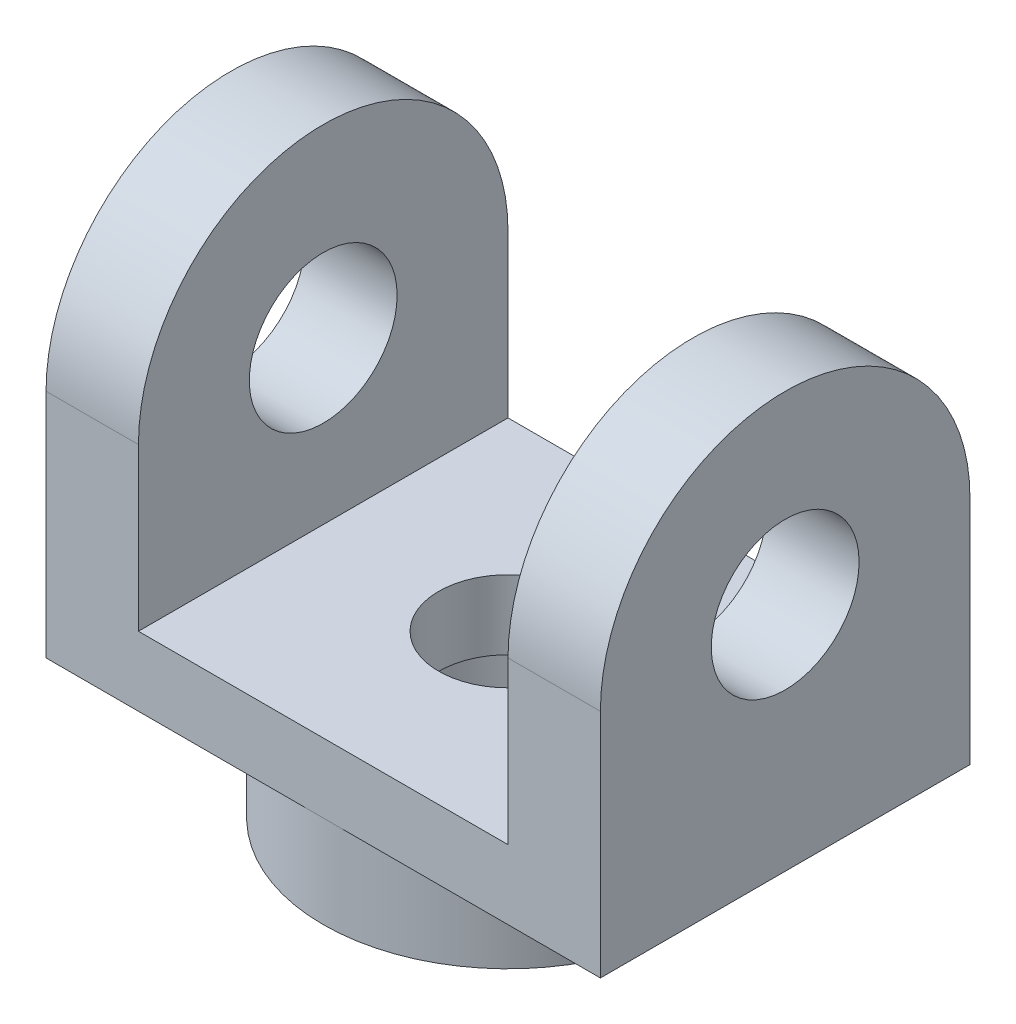
ISO-10303-21;
HEADER;
FILE_DESCRIPTION(('STEP AP214'),'2;1');
FILE_NAME('part.step','',(''),(''),'','','');
FILE_SCHEMA(('AUTOMOTIVE_DESIGN { 1 0 10303 214 1 1 1 1 }'));
ENDSEC;
DATA;
#1=APPLICATION_CONTEXT('core data for automotive mechanical design processes');
#2=APPLICATION_PROTOCOL_DEFINITION('international standard','automotive_design',2000,#1);
#3=PRODUCT_CONTEXT('',#1,'mechanical');
#4=PRODUCT('Part','Part','',(#3));
#5=PRODUCT_RELATED_PRODUCT_CATEGORY('part','',(#4));
#6=PRODUCT_DEFINITION_FORMATION('','',#4);
#7=PRODUCT_DEFINITION_CONTEXT('part definition',#1,'design');
#8=PRODUCT_DEFINITION('design','',#6,#7);
#9=PRODUCT_DEFINITION_SHAPE('','',#8);
#10=(LENGTH_UNIT() NAMED_UNIT(*) SI_UNIT(.MILLI.,.METRE.));
#11=(NAMED_UNIT(*) PLANE_ANGLE_UNIT() SI_UNIT($,.RADIAN.));
#12=(NAMED_UNIT(*) SI_UNIT($,.STERADIAN.) SOLID_ANGLE_UNIT());
#13=UNCERTAINTY_MEASURE_WITH_UNIT(LENGTH_MEASURE(1.E-05),#10,'distance_accuracy_value','');
#14=(GEOMETRIC_REPRESENTATION_CONTEXT(3) GLOBAL_UNCERTAINTY_ASSIGNED_CONTEXT((#13)) GLOBAL_UNIT_ASSIGNED_CONTEXT((#10,
#11,#12)) REPRESENTATION_CONTEXT('',''));
#15=CARTESIAN_POINT('',(0.,0.,0.));
#16=DIRECTION('',(0.,0.,1.));
#17=DIRECTION('',(1.,0.,0.));
#18=AXIS2_PLACEMENT_3D('',#15,#16,#17);
#19=CARTESIAN_POINT('',(0.,35.,0.));
#20=DIRECTION('',(0.,-1.,0.));
#21=DIRECTION('',(0.,0.,-1.));
#22=AXIS2_PLACEMENT_3D('',#19,#20,#21);
#23=PLANE('',#22);
#24=CARTESIAN_POINT('',(0.,35.,0.));
#25=DIRECTION('',(0.,-1.,0.));
#26=DIRECTION('',(0.,0.,-1.));
#27=AXIS2_PLACEMENT_3D('',#24,#25,#26);
#28=CIRCLE('',#27,15.);
#29=CARTESIAN_POINT('',(0.,35.,-15.));
#30=VERTEX_POINT('',#29);
#31=EDGE_CURVE('E42',#30,#30,#28,.T.);
#32=ORIENTED_EDGE('',*,*,#31,.T.);
#33=EDGE_LOOP('',(#32));
#34=FACE_BOUND('',#33,.T.);
#35=DIRECTION('',(0.,0.,1.));
#36=VECTOR('',#35,1.);
#37=CARTESIAN_POINT('',(-40.,35.,-40.));
#38=LINE('',#37,#36);
#39=CARTESIAN_POINT('',(-40.,35.,-40.));
#40=VERTEX_POINT('',#39);
#41=CARTESIAN_POINT('',(-40.,35.,40.));
#42=VERTEX_POINT('',#41);
#43=EDGE_CURVE('E55',#40,#42,#38,.T.);
#44=ORIENTED_EDGE('',*,*,#43,.T.);
#45=DIRECTION('',(1.,0.,0.));
#46=VECTOR('',#45,1.);
#47=CARTESIAN_POINT('',(-60.,35.,40.));
#48=LINE('',#47,#46);
#49=CARTESIAN_POINT('',(40.,35.,40.));
#50=VERTEX_POINT('',#49);
#51=EDGE_CURVE('E174',#42,#50,#48,.T.);
#52=ORIENTED_EDGE('',*,*,#51,.T.);
#53=DIRECTION('',(0.,0.,1.));
#54=VECTOR('',#53,1.);
#55=CARTESIAN_POINT('',(40.,35.,-40.));
#56=LINE('',#55,#54);
#57=CARTESIAN_POINT('',(40.,35.,-40.));
#58=VERTEX_POINT('',#57);
#59=EDGE_CURVE('E164',#58,#50,#56,.T.);
#60=ORIENTED_EDGE('',*,*,#59,.F.);
#61=DIRECTION('',(-1.,0.,0.));
#62=VECTOR('',#61,1.);
#63=CARTESIAN_POINT('',(-60.,35.,-40.));
#64=LINE('',#63,#62);
#65=EDGE_CURVE('E60',#58,#40,#64,.T.);
#66=ORIENTED_EDGE('',*,*,#65,.T.);
#67=EDGE_LOOP('',(#44,#52,#60,#66));
#68=FACE_BOUND('',#67,.T.);
#69=ADVANCED_FACE('F38',(#34,#68),#23,.F.);
#70=CARTESIAN_POINT('',(0.,20.,0.));
#71=DIRECTION('',(0.,-1.,0.));
#72=DIRECTION('',(0.,0.,-1.));
#73=AXIS2_PLACEMENT_3D('',#70,#71,#72);
#74=CYLINDRICAL_SURFACE('',#73,30.);
#75=CARTESIAN_POINT('',(0.,20.,0.));
#76=DIRECTION('',(0.,1.,0.));
#77=DIRECTION('',(0.,0.,1.));
#78=AXIS2_PLACEMENT_3D('',#75,#76,#77);
#79=CIRCLE('',#78,30.);
#80=CARTESIAN_POINT('',(0.,20.,30.));
#81=VERTEX_POINT('',#80);
#82=EDGE_CURVE('E193',#81,#81,#79,.T.);
#83=ORIENTED_EDGE('',*,*,#82,.T.);
#84=EDGE_LOOP('',(#83));
#85=FACE_BOUND('',#84,.T.);
#86=CARTESIAN_POINT('',(0.,0.,0.));
#87=DIRECTION('',(0.,1.,0.));
#88=DIRECTION('',(0.,0.,1.));
#89=AXIS2_PLACEMENT_3D('',#86,#87,#88);
#90=CIRCLE('',#89,30.);
#91=CARTESIAN_POINT('',(0.,0.,30.));
#92=VERTEX_POINT('',#91);
#93=EDGE_CURVE('E195',#92,#92,#90,.T.);
#94=ORIENTED_EDGE('',*,*,#93,.F.);
#95=EDGE_LOOP('',(#94));
#96=FACE_BOUND('',#95,.T.);
#97=ADVANCED_FACE('F40',(#85,#96),#74,.F.);
#98=CARTESIAN_POINT('',(0.,20.,0.));
#99=DIRECTION('',(0.,-1.,0.));
#100=DIRECTION('',(0.,0.,-1.));
#101=AXIS2_PLACEMENT_3D('',#98,#99,#100);
#102=CYLINDRICAL_SURFACE('',#101,40.);
#103=CARTESIAN_POINT('',(0.,20.,0.));
#104=DIRECTION('',(0.,1.,0.));
#105=DIRECTION('',(0.,0.,1.));
#106=AXIS2_PLACEMENT_3D('',#103,#104,#105);
#107=CIRCLE('',#106,40.);
#108=CARTESIAN_POINT('',(0.,20.,40.));
#109=VERTEX_POINT('',#108);
#110=CARTESIAN_POINT('',(0.,20.,-40.));
#111=VERTEX_POINT('',#110);
#112=EDGE_CURVE('E11',#109,#111,#107,.T.);
#113=ORIENTED_EDGE('',*,*,#112,.F.);
#114=EDGE_CURVE('E47',#111,#109,#107,.T.);
#115=ORIENTED_EDGE('',*,*,#114,.F.);
#116=EDGE_LOOP('',(#113,#115));
#117=FACE_BOUND('',#116,.T.);
#118=CARTESIAN_POINT('',(0.,0.,0.));
#119=DIRECTION('',(0.,1.,0.));
#120=DIRECTION('',(0.,0.,1.));
#121=AXIS2_PLACEMENT_3D('',#118,#119,#120);
#122=CIRCLE('',#121,40.);
#123=CARTESIAN_POINT('',(0.,0.,40.));
#124=VERTEX_POINT('',#123);
#125=EDGE_CURVE('E198',#124,#124,#122,.T.);
#126=ORIENTED_EDGE('',*,*,#125,.T.);
#127=EDGE_LOOP('',(#126));
#128=FACE_BOUND('',#127,.T.);
#129=ADVANCED_FACE('F251',(#117,#128),#102,.T.);
#130=CARTESIAN_POINT('',(0.,0.,0.));
#131=DIRECTION('',(0.,1.,0.));
#132=DIRECTION('',(0.,0.,1.));
#133=AXIS2_PLACEMENT_3D('',#130,#131,#132);
#134=PLANE('',#133);
#135=ORIENTED_EDGE('',*,*,#93,.T.);
#136=EDGE_LOOP('',(#135));
#137=FACE_BOUND('',#136,.T.);
#138=ORIENTED_EDGE('',*,*,#125,.F.);
#139=EDGE_LOOP('',(#138));
#140=FACE_BOUND('',#139,.T.);
#141=ADVANCED_FACE('F260',(#137,#140),#134,.F.);
#142=CARTESIAN_POINT('',(0.,20.,0.));
#143=DIRECTION('',(0.,-1.,0.));
#144=DIRECTION('',(0.,0.,-1.));
#145=AXIS2_PLACEMENT_3D('',#142,#143,#144);
#146=PLANE('',#145);
#147=DIRECTION('',(-1.,0.,0.));
#148=VECTOR('',#147,1.);
#149=CARTESIAN_POINT('',(-60.,20.,-40.));
#150=LINE('',#149,#148);
#151=CARTESIAN_POINT('',(-60.,20.,-40.));
#152=VERTEX_POINT('',#151);
#153=EDGE_CURVE('E180',#111,#152,#150,.T.);
#154=ORIENTED_EDGE('',*,*,#153,.F.);
#155=ORIENTED_EDGE('',*,*,#114,.T.);
#156=DIRECTION('',(1.,0.,0.));
#157=VECTOR('',#156,1.);
#158=CARTESIAN_POINT('',(-60.,20.,40.));
#159=LINE('',#158,#157);
#160=CARTESIAN_POINT('',(-60.,20.,40.));
#161=VERTEX_POINT('',#160);
#162=EDGE_CURVE('E175',#161,#109,#159,.T.);
#163=ORIENTED_EDGE('',*,*,#162,.F.);
#164=DIRECTION('',(0.,0.,1.));
#165=VECTOR('',#164,1.);
#166=CARTESIAN_POINT('',(-60.,20.,40.));
#167=LINE('',#166,#165);
#168=EDGE_CURVE('E128',#152,#161,#167,.T.);
#169=ORIENTED_EDGE('',*,*,#168,.F.);
#170=EDGE_LOOP('',(#154,#155,#163,#169));
#171=FACE_BOUND('',#170,.T.);
#172=ADVANCED_FACE('F206',(#171),#146,.T.);
#173=CARTESIAN_POINT('',(-60.,35.,40.));
#174=DIRECTION('',(0.,0.,-1.));
#175=DIRECTION('',(-1.,0.,0.));
#176=AXIS2_PLACEMENT_3D('',#173,#174,#175);
#177=PLANE('',#176);
#178=ORIENTED_EDGE('',*,*,#162,.T.);
#179=CARTESIAN_POINT('',(60.,20.,40.));
#180=VERTEX_POINT('',#179);
#181=EDGE_CURVE('E185',#109,#180,#159,.T.);
#182=ORIENTED_EDGE('',*,*,#181,.T.);
#183=DIRECTION('',(0.,-1.,0.));
#184=VECTOR('',#183,1.);
#185=CARTESIAN_POINT('',(60.,35.,40.));
#186=LINE('',#185,#184);
#187=CARTESIAN_POINT('',(60.,70.,40.));
#188=VERTEX_POINT('',#187);
#189=EDGE_CURVE('E133',#188,#180,#186,.T.);
#190=ORIENTED_EDGE('',*,*,#189,.F.);
#191=DIRECTION('',(-1.,0.,0.));
#192=VECTOR('',#191,1.);
#193=CARTESIAN_POINT('',(60.,70.,40.));
#194=LINE('',#193,#192);
#195=CARTESIAN_POINT('',(40.,70.,40.));
#196=VERTEX_POINT('',#195);
#197=EDGE_CURVE('E154',#188,#196,#194,.T.);
#198=ORIENTED_EDGE('',*,*,#197,.T.);
#199=DIRECTION('',(0.,-1.,0.));
#200=VECTOR('',#199,1.);
#201=CARTESIAN_POINT('',(40.,35.,40.));
#202=LINE('',#201,#200);
#203=EDGE_CURVE('E161',#196,#50,#202,.T.);
#204=ORIENTED_EDGE('',*,*,#203,.T.);
#205=ORIENTED_EDGE('',*,*,#51,.F.);
#206=DIRECTION('',(0.,-1.,0.));
#207=VECTOR('',#206,1.);
#208=CARTESIAN_POINT('',(-40.,35.,40.));
#209=LINE('',#208,#207);
#210=CARTESIAN_POINT('',(-40.,70.,40.));
#211=VERTEX_POINT('',#210);
#212=EDGE_CURVE('E121',#211,#42,#209,.T.);
#213=ORIENTED_EDGE('',*,*,#212,.F.);
#214=DIRECTION('',(1.,0.,0.));
#215=VECTOR('',#214,1.);
#216=CARTESIAN_POINT('',(-60.,70.,40.));
#217=LINE('',#216,#215);
#218=CARTESIAN_POINT('',(-60.,70.,40.));
#219=VERTEX_POINT('',#218);
#220=EDGE_CURVE('E114',#219,#211,#217,.T.);
#221=ORIENTED_EDGE('',*,*,#220,.F.);
#222=DIRECTION('',(0.,-1.,0.));
#223=VECTOR('',#222,1.);
#224=CARTESIAN_POINT('',(-60.,35.,40.));
#225=LINE('',#224,#223);
#226=EDGE_CURVE('E125',#219,#161,#225,.T.);
#227=ORIENTED_EDGE('',*,*,#226,.T.);
#228=EDGE_LOOP('',(#178,#182,#190,#198,#204,#205,#213,#221,#227));
#229=FACE_BOUND('',#228,.T.);
#230=ADVANCED_FACE('F135',(#229),#177,.F.);
#231=CARTESIAN_POINT('',(-60.,35.,40.));
#232=DIRECTION('',(1.,0.,0.));
#233=DIRECTION('',(0.,0.,-1.));
#234=AXIS2_PLACEMENT_3D('',#231,#232,#233);
#235=PLANE('',#234);
#236=CARTESIAN_POINT('',(-60.,70.,0.));
#237=DIRECTION('',(1.,0.,0.));
#238=DIRECTION('',(0.,0.,-1.));
#239=AXIS2_PLACEMENT_3D('',#236,#237,#238);
#240=CIRCLE('',#239,16.);
#241=CARTESIAN_POINT('',(-60.,70.,-16.));
#242=VERTEX_POINT('',#241);
#243=EDGE_CURVE('E230',#242,#242,#240,.T.);
#244=ORIENTED_EDGE('',*,*,#243,.T.);
#245=EDGE_LOOP('',(#244));
#246=FACE_BOUND('',#245,.T.);
#247=ORIENTED_EDGE('',*,*,#168,.T.);
#248=ORIENTED_EDGE('',*,*,#226,.F.);
#249=CARTESIAN_POINT('',(-60.,70.,0.));
#250=DIRECTION('',(-1.,0.,0.));
#251=DIRECTION('',(0.,0.,1.));
#252=AXIS2_PLACEMENT_3D('',#249,#250,#251);
#253=CIRCLE('',#252,40.);
#254=CARTESIAN_POINT('',(-60.,70.,-40.));
#255=VERTEX_POINT('',#254);
#256=EDGE_CURVE('E110',#219,#255,#253,.T.);
#257=ORIENTED_EDGE('',*,*,#256,.T.);
#258=DIRECTION('',(0.,-1.,0.));
#259=VECTOR('',#258,1.);
#260=CARTESIAN_POINT('',(-60.,35.,-40.));
#261=LINE('',#260,#259);
#262=EDGE_CURVE('E132',#255,#152,#261,.T.);
#263=ORIENTED_EDGE('',*,*,#262,.T.);
#264=EDGE_LOOP('',(#247,#248,#257,#263));
#265=FACE_BOUND('',#264,.T.);
#266=ADVANCED_FACE('F126',(#246,#265),#235,.F.);
#267=CARTESIAN_POINT('',(-60.,35.,-40.));
#268=DIRECTION('',(0.,0.,1.));
#269=DIRECTION('',(1.,0.,0.));
#270=AXIS2_PLACEMENT_3D('',#267,#268,#269);
#271=PLANE('',#270);
#272=CARTESIAN_POINT('',(60.,20.,-40.));
#273=VERTEX_POINT('',#272);
#274=EDGE_CURVE('E181',#273,#111,#150,.T.);
#275=ORIENTED_EDGE('',*,*,#274,.T.);
#276=ORIENTED_EDGE('',*,*,#153,.T.);
#277=ORIENTED_EDGE('',*,*,#262,.F.);
#278=DIRECTION('',(1.,0.,0.));
#279=VECTOR('',#278,1.);
#280=CARTESIAN_POINT('',(-60.,70.,-40.));
#281=LINE('',#280,#279);
#282=CARTESIAN_POINT('',(-40.,70.,-40.));
#283=VERTEX_POINT('',#282);
#284=EDGE_CURVE('E117',#255,#283,#281,.T.);
#285=ORIENTED_EDGE('',*,*,#284,.T.);
#286=DIRECTION('',(0.,-1.,0.));
#287=VECTOR('',#286,1.);
#288=CARTESIAN_POINT('',(-40.,35.,-40.));
#289=LINE('',#288,#287);
#290=EDGE_CURVE('E137',#283,#40,#289,.T.);
#291=ORIENTED_EDGE('',*,*,#290,.T.);
#292=ORIENTED_EDGE('',*,*,#65,.F.);
#293=DIRECTION('',(0.,-1.,0.));
#294=VECTOR('',#293,1.);
#295=CARTESIAN_POINT('',(40.,35.,-40.));
#296=LINE('',#295,#294);
#297=CARTESIAN_POINT('',(40.,70.,-40.));
#298=VERTEX_POINT('',#297);
#299=EDGE_CURVE('E160',#298,#58,#296,.T.);
#300=ORIENTED_EDGE('',*,*,#299,.F.);
#301=DIRECTION('',(-1.,0.,0.));
#302=VECTOR('',#301,1.);
#303=CARTESIAN_POINT('',(60.,70.,-40.));
#304=LINE('',#303,#302);
#305=CARTESIAN_POINT('',(60.,70.,-40.));
#306=VERTEX_POINT('',#305);
#307=EDGE_CURVE('E157',#306,#298,#304,.T.);
#308=ORIENTED_EDGE('',*,*,#307,.F.);
#309=DIRECTION('',(0.,-1.,0.));
#310=VECTOR('',#309,1.);
#311=CARTESIAN_POINT('',(60.,35.,-40.));
#312=LINE('',#311,#310);
#313=EDGE_CURVE('E190',#306,#273,#312,.T.);
#314=ORIENTED_EDGE('',*,*,#313,.T.);
#315=EDGE_LOOP('',(#275,#276,#277,#285,#291,#292,#300,#308,#314));
#316=FACE_BOUND('',#315,.T.);
#317=ADVANCED_FACE('F223',(#316),#271,.F.);
#318=CARTESIAN_POINT('',(60.,35.,40.));
#319=DIRECTION('',(-1.,0.,0.));
#320=DIRECTION('',(0.,0.,1.));
#321=AXIS2_PLACEMENT_3D('',#318,#319,#320);
#322=PLANE('',#321);
#323=CARTESIAN_POINT('',(60.,70.,0.));
#324=DIRECTION('',(1.,0.,0.));
#325=DIRECTION('',(0.,0.,-1.));
#326=AXIS2_PLACEMENT_3D('',#323,#324,#325);
#327=CIRCLE('',#326,16.);
#328=CARTESIAN_POINT('',(60.,70.,-16.));
#329=VERTEX_POINT('',#328);
#330=EDGE_CURVE('E144',#329,#329,#327,.T.);
#331=ORIENTED_EDGE('',*,*,#330,.F.);
#332=EDGE_LOOP('',(#331));
#333=FACE_BOUND('',#332,.T.);
#334=DIRECTION('',(0.,0.,-1.));
#335=VECTOR('',#334,1.);
#336=CARTESIAN_POINT('',(60.,20.,40.));
#337=LINE('',#336,#335);
#338=EDGE_CURVE('E177',#180,#273,#337,.T.);
#339=ORIENTED_EDGE('',*,*,#338,.T.);
#340=ORIENTED_EDGE('',*,*,#313,.F.);
#341=CARTESIAN_POINT('',(60.,70.,0.));
#342=DIRECTION('',(-1.,0.,0.));
#343=DIRECTION('',(0.,0.,1.));
#344=AXIS2_PLACEMENT_3D('',#341,#342,#343);
#345=CIRCLE('',#344,40.);
#346=EDGE_CURVE('E151',#188,#306,#345,.T.);
#347=ORIENTED_EDGE('',*,*,#346,.F.);
#348=ORIENTED_EDGE('',*,*,#189,.T.);
#349=EDGE_LOOP('',(#339,#340,#347,#348));
#350=FACE_BOUND('',#349,.T.);
#351=ADVANCED_FACE('F214',(#333,#350),#322,.F.);
#352=ORIENTED_EDGE('',*,*,#181,.F.);
#353=ORIENTED_EDGE('',*,*,#112,.T.);
#354=ORIENTED_EDGE('',*,*,#274,.F.);
#355=ORIENTED_EDGE('',*,*,#338,.F.);
#356=EDGE_LOOP('',(#352,#353,#354,#355));
#357=FACE_BOUND('',#356,.T.);
#358=ADVANCED_FACE('F210',(#357),#146,.T.);
#359=CARTESIAN_POINT('',(0.,20.,0.));
#360=DIRECTION('',(0.,-1.,0.));
#361=DIRECTION('',(0.,0.,-1.));
#362=AXIS2_PLACEMENT_3D('',#359,#360,#361);
#363=CIRCLE('',#362,15.);
#364=CARTESIAN_POINT('',(0.,20.,-15.));
#365=VERTEX_POINT('',#364);
#366=EDGE_CURVE('E170',#365,#365,#363,.T.);
#367=ORIENTED_EDGE('',*,*,#366,.F.);
#368=EDGE_LOOP('',(#367));
#369=FACE_BOUND('',#368,.T.);
#370=ORIENTED_EDGE('',*,*,#82,.F.);
#371=EDGE_LOOP('',(#370));
#372=FACE_BOUND('',#371,.T.);
#373=ADVANCED_FACE('F261',(#369,#372),#146,.T.);
#374=CARTESIAN_POINT('',(0.,57.,0.));
#375=DIRECTION('',(0.,-1.,0.));
#376=DIRECTION('',(0.,0.,-1.));
#377=AXIS2_PLACEMENT_3D('',#374,#375,#376);
#378=CYLINDRICAL_SURFACE('',#377,15.);
#379=ORIENTED_EDGE('',*,*,#366,.T.);
#380=EDGE_LOOP('',(#379));
#381=FACE_BOUND('',#380,.T.);
#382=ORIENTED_EDGE('',*,*,#31,.F.);
#383=EDGE_LOOP('',(#382));
#384=FACE_BOUND('',#383,.T.);
#385=ADVANCED_FACE('F256',(#381,#384),#378,.F.);
#386=CARTESIAN_POINT('',(40.,35.,-40.));
#387=DIRECTION('',(-1.,0.,0.));
#388=DIRECTION('',(0.,0.,1.));
#389=AXIS2_PLACEMENT_3D('',#386,#387,#388);
#390=PLANE('',#389);
#391=CARTESIAN_POINT('',(40.,70.,0.));
#392=DIRECTION('',(1.,0.,0.));
#393=DIRECTION('',(0.,0.,-1.));
#394=AXIS2_PLACEMENT_3D('',#391,#392,#393);
#395=CIRCLE('',#394,16.);
#396=CARTESIAN_POINT('',(40.,70.,-16.));
#397=VERTEX_POINT('',#396);
#398=EDGE_CURVE('E145',#397,#397,#395,.T.);
#399=ORIENTED_EDGE('',*,*,#398,.T.);
#400=EDGE_LOOP('',(#399));
#401=FACE_BOUND('',#400,.T.);
#402=ORIENTED_EDGE('',*,*,#203,.F.);
#403=CARTESIAN_POINT('',(40.,70.,0.));
#404=DIRECTION('',(-1.,0.,0.));
#405=DIRECTION('',(0.,0.,1.));
#406=AXIS2_PLACEMENT_3D('',#403,#404,#405);
#407=CIRCLE('',#406,40.);
#408=EDGE_CURVE('E148',#196,#298,#407,.T.);
#409=ORIENTED_EDGE('',*,*,#408,.T.);
#410=ORIENTED_EDGE('',*,*,#299,.T.);
#411=ORIENTED_EDGE('',*,*,#59,.T.);
#412=EDGE_LOOP('',(#402,#409,#410,#411));
#413=FACE_BOUND('',#412,.T.);
#414=ADVANCED_FACE('F221',(#401,#413),#390,.T.);
#415=CARTESIAN_POINT('',(60.,70.,0.));
#416=DIRECTION('',(-1.,0.,0.));
#417=DIRECTION('',(0.,0.,1.));
#418=AXIS2_PLACEMENT_3D('',#415,#416,#417);
#419=CYLINDRICAL_SURFACE('',#418,40.);
#420=ORIENTED_EDGE('',*,*,#408,.F.);
#421=ORIENTED_EDGE('',*,*,#197,.F.);
#422=ORIENTED_EDGE('',*,*,#346,.T.);
#423=ORIENTED_EDGE('',*,*,#307,.T.);
#424=EDGE_LOOP('',(#420,#421,#422,#423));
#425=FACE_BOUND('',#424,.T.);
#426=ADVANCED_FACE('F218',(#425),#419,.T.);
#427=CARTESIAN_POINT('',(40.,70.,0.));
#428=DIRECTION('',(1.,0.,0.));
#429=DIRECTION('',(0.,0.,-1.));
#430=AXIS2_PLACEMENT_3D('',#427,#428,#429);
#431=CYLINDRICAL_SURFACE('',#430,16.);
#432=ORIENTED_EDGE('',*,*,#398,.F.);
#433=EDGE_LOOP('',(#432));
#434=FACE_BOUND('',#433,.T.);
#435=ORIENTED_EDGE('',*,*,#330,.T.);
#436=EDGE_LOOP('',(#435));
#437=FACE_BOUND('',#436,.T.);
#438=ADVANCED_FACE('F333',(#434,#437),#431,.F.);
#439=CARTESIAN_POINT('',(-40.,35.,-40.));
#440=DIRECTION('',(-1.,0.,0.));
#441=DIRECTION('',(0.,0.,1.));
#442=AXIS2_PLACEMENT_3D('',#439,#440,#441);
#443=PLANE('',#442);
#444=CARTESIAN_POINT('',(-40.,70.,0.));
#445=DIRECTION('',(1.,0.,0.));
#446=DIRECTION('',(0.,0.,-1.));
#447=AXIS2_PLACEMENT_3D('',#444,#445,#446);
#448=CIRCLE('',#447,16.);
#449=CARTESIAN_POINT('',(-40.,70.,-16.));
#450=VERTEX_POINT('',#449);
#451=EDGE_CURVE('E227',#450,#450,#448,.T.);
#452=ORIENTED_EDGE('',*,*,#451,.F.);
#453=EDGE_LOOP('',(#452));
#454=FACE_BOUND('',#453,.T.);
#455=ORIENTED_EDGE('',*,*,#212,.T.);
#456=ORIENTED_EDGE('',*,*,#43,.F.);
#457=ORIENTED_EDGE('',*,*,#290,.F.);
#458=CARTESIAN_POINT('',(-40.,70.,0.));
#459=DIRECTION('',(-1.,0.,0.));
#460=DIRECTION('',(0.,0.,1.));
#461=AXIS2_PLACEMENT_3D('',#458,#459,#460);
#462=CIRCLE('',#461,40.);
#463=EDGE_CURVE('E122',#211,#283,#462,.T.);
#464=ORIENTED_EDGE('',*,*,#463,.F.);
#465=EDGE_LOOP('',(#455,#456,#457,#464));
#466=FACE_BOUND('',#465,.T.);
#467=ADVANCED_FACE('F226',(#454,#466),#443,.F.);
#468=CARTESIAN_POINT('',(-60.,70.,0.));
#469=DIRECTION('',(1.,0.,0.));
#470=DIRECTION('',(0.,0.,-1.));
#471=AXIS2_PLACEMENT_3D('',#468,#469,#470);
#472=CYLINDRICAL_SURFACE('',#471,40.);
#473=ORIENTED_EDGE('',*,*,#463,.T.);
#474=ORIENTED_EDGE('',*,*,#284,.F.);
#475=ORIENTED_EDGE('',*,*,#256,.F.);
#476=ORIENTED_EDGE('',*,*,#220,.T.);
#477=EDGE_LOOP('',(#473,#474,#475,#476));
#478=FACE_BOUND('',#477,.T.);
#479=ADVANCED_FACE('F112',(#478),#472,.T.);
#480=CARTESIAN_POINT('',(-40.,70.,0.));
#481=DIRECTION('',(-1.,0.,0.));
#482=DIRECTION('',(0.,0.,1.));
#483=AXIS2_PLACEMENT_3D('',#480,#481,#482);
#484=CYLINDRICAL_SURFACE('',#483,16.);
#485=ORIENTED_EDGE('',*,*,#451,.T.);
#486=EDGE_LOOP('',(#485));
#487=FACE_BOUND('',#486,.T.);
#488=ORIENTED_EDGE('',*,*,#243,.F.);
#489=EDGE_LOOP('',(#488));
#490=FACE_BOUND('',#489,.T.);
#491=ADVANCED_FACE('F237',(#487,#490),#484,.F.);
#492=CLOSED_SHELL('',(#69,#97,#129,#141,#172,#230,#266,#317,#351,#358,#373,#385,#414,#426,#438,
#467,#479,#491));
#493=MANIFOLD_SOLID_BREP('B2',#492);
#494=ADVANCED_BREP_SHAPE_REPRESENTATION('',(#18,#493),#14);
#495=SHAPE_DEFINITION_REPRESENTATION(#9,#494);
ENDSEC;
END-ISO-10303-21;
